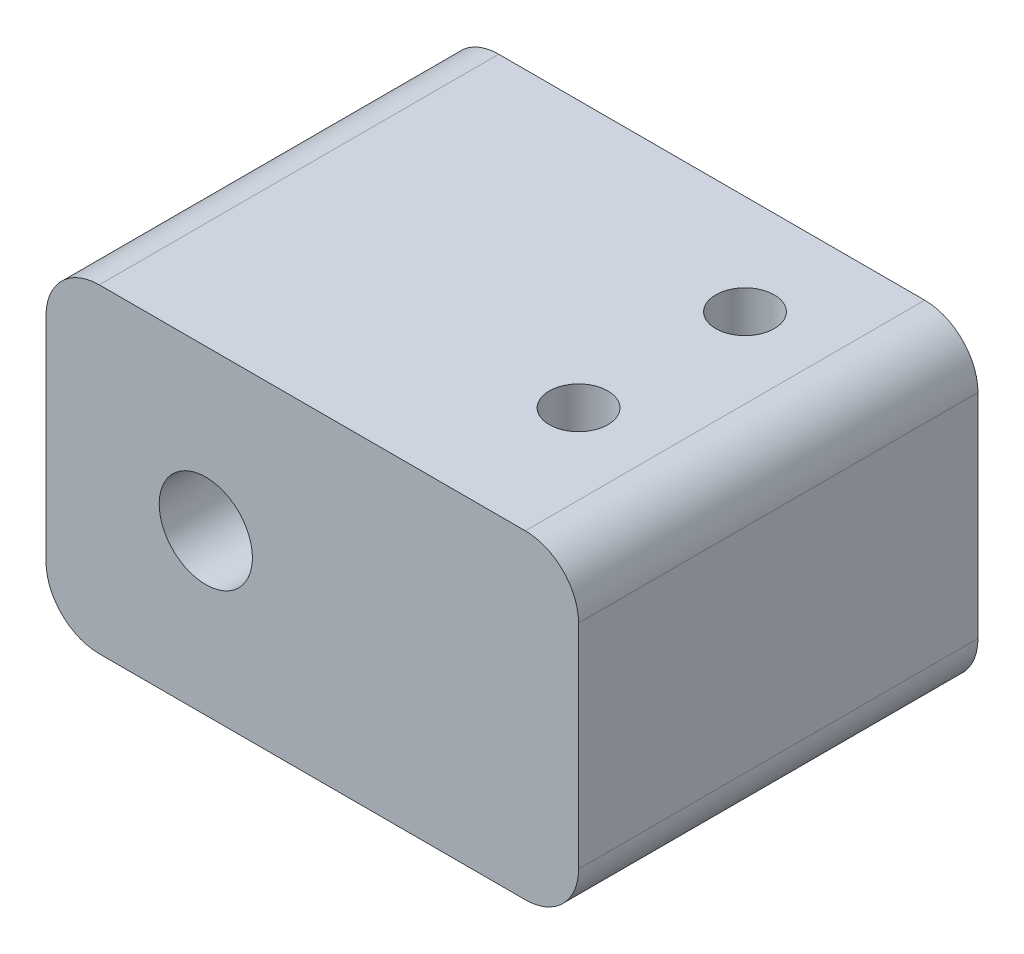
ISO-10303-21;
HEADER;
FILE_DESCRIPTION(('STEP AP214'),'2;1');
FILE_NAME('part.step','',(''),(''),'','','');
FILE_SCHEMA(('AUTOMOTIVE_DESIGN { 1 0 10303 214 1 1 1 1 }'));
ENDSEC;
DATA;
#1=APPLICATION_CONTEXT('core data for automotive mechanical design processes');
#2=APPLICATION_PROTOCOL_DEFINITION('international standard','automotive_design',2000,#1);
#3=PRODUCT_CONTEXT('',#1,'mechanical');
#4=PRODUCT('Part','Part','',(#3));
#5=PRODUCT_RELATED_PRODUCT_CATEGORY('part','',(#4));
#6=PRODUCT_DEFINITION_FORMATION('','',#4);
#7=PRODUCT_DEFINITION_CONTEXT('part definition',#1,'design');
#8=PRODUCT_DEFINITION('design','',#6,#7);
#9=PRODUCT_DEFINITION_SHAPE('','',#8);
#10=(LENGTH_UNIT() NAMED_UNIT(*) SI_UNIT(.MILLI.,.METRE.));
#11=(NAMED_UNIT(*) PLANE_ANGLE_UNIT() SI_UNIT($,.RADIAN.));
#12=(NAMED_UNIT(*) SI_UNIT($,.STERADIAN.) SOLID_ANGLE_UNIT());
#13=UNCERTAINTY_MEASURE_WITH_UNIT(LENGTH_MEASURE(1.E-05),#10,'distance_accuracy_value','');
#14=(GEOMETRIC_REPRESENTATION_CONTEXT(3) GLOBAL_UNCERTAINTY_ASSIGNED_CONTEXT((#13)) GLOBAL_UNIT_ASSIGNED_CONTEXT((#10,
#11,#12)) REPRESENTATION_CONTEXT('',''));
#15=CARTESIAN_POINT('',(0.,0.,0.));
#16=DIRECTION('',(0.,0.,1.));
#17=DIRECTION('',(1.,0.,0.));
#18=AXIS2_PLACEMENT_3D('',#15,#16,#17);
#19=CARTESIAN_POINT('',(0.,0.,-15.));
#20=DIRECTION('',(0.,0.,-1.));
#21=DIRECTION('',(-1.,0.,0.));
#22=AXIS2_PLACEMENT_3D('',#19,#20,#21);
#23=PLANE('',#22);
#24=DIRECTION('',(1.,0.,0.));
#25=VECTOR('',#24,1.);
#26=CARTESIAN_POINT('',(-6.,6.,-15.));
#27=LINE('',#26,#25);
#28=CARTESIAN_POINT('',(-4.,6.,-15.));
#29=VERTEX_POINT('',#28);
#30=CARTESIAN_POINT('',(12.,6.,-15.));
#31=VERTEX_POINT('',#30);
#32=EDGE_CURVE('E189',#29,#31,#27,.T.);
#33=ORIENTED_EDGE('',*,*,#32,.T.);
#34=CARTESIAN_POINT('',(12.,4.,-15.));
#35=DIRECTION('',(0.,0.,-1.));
#36=DIRECTION('',(-1.,0.,0.));
#37=AXIS2_PLACEMENT_3D('',#34,#35,#36);
#38=CIRCLE('',#37,2.);
#39=CARTESIAN_POINT('',(14.,4.,-15.));
#40=VERTEX_POINT('',#39);
#41=EDGE_CURVE('E228',#31,#40,#38,.T.);
#42=ORIENTED_EDGE('',*,*,#41,.T.);
#43=DIRECTION('',(0.,1.,0.));
#44=VECTOR('',#43,1.);
#45=CARTESIAN_POINT('',(14.,-6.,-15.));
#46=LINE('',#45,#44);
#47=CARTESIAN_POINT('',(14.,-4.,-15.));
#48=VERTEX_POINT('',#47);
#49=EDGE_CURVE('E165',#48,#40,#46,.T.);
#50=ORIENTED_EDGE('',*,*,#49,.F.);
#51=CARTESIAN_POINT('',(12.,-4.,-15.));
#52=DIRECTION('',(0.,0.,-1.));
#53=DIRECTION('',(-1.,0.,0.));
#54=AXIS2_PLACEMENT_3D('',#51,#52,#53);
#55=CIRCLE('',#54,2.);
#56=CARTESIAN_POINT('',(12.,-6.,-15.));
#57=VERTEX_POINT('',#56);
#58=EDGE_CURVE('E226',#48,#57,#55,.T.);
#59=ORIENTED_EDGE('',*,*,#58,.T.);
#60=DIRECTION('',(-1.,0.,0.));
#61=VECTOR('',#60,1.);
#62=CARTESIAN_POINT('',(-6.,-6.,-15.));
#63=LINE('',#62,#61);
#64=CARTESIAN_POINT('',(-4.,-6.,-15.));
#65=VERTEX_POINT('',#64);
#66=EDGE_CURVE('E182',#57,#65,#63,.T.);
#67=ORIENTED_EDGE('',*,*,#66,.T.);
#68=CARTESIAN_POINT('',(-4.,-4.,-15.));
#69=DIRECTION('',(0.,0.,-1.));
#70=DIRECTION('',(-1.,0.,0.));
#71=AXIS2_PLACEMENT_3D('',#68,#69,#70);
#72=CIRCLE('',#71,2.);
#73=CARTESIAN_POINT('',(-6.,-4.,-15.));
#74=VERTEX_POINT('',#73);
#75=EDGE_CURVE('E222',#65,#74,#72,.T.);
#76=ORIENTED_EDGE('',*,*,#75,.T.);
#77=DIRECTION('',(0.,1.,0.));
#78=VECTOR('',#77,1.);
#79=CARTESIAN_POINT('',(-6.,-6.,-15.));
#80=LINE('',#79,#78);
#81=CARTESIAN_POINT('',(-6.,4.,-15.));
#82=VERTEX_POINT('',#81);
#83=EDGE_CURVE('E185',#74,#82,#80,.T.);
#84=ORIENTED_EDGE('',*,*,#83,.T.);
#85=CARTESIAN_POINT('',(-4.,4.,-15.));
#86=DIRECTION('',(0.,0.,-1.));
#87=DIRECTION('',(-1.,0.,0.));
#88=AXIS2_PLACEMENT_3D('',#85,#86,#87);
#89=CIRCLE('',#88,2.);
#90=EDGE_CURVE('E224',#82,#29,#89,.T.);
#91=ORIENTED_EDGE('',*,*,#90,.T.);
#92=EDGE_LOOP('',(#33,#42,#50,#59,#67,#76,#84,#91));
#93=FACE_BOUND('',#92,.T.);
#94=DIRECTION('',(-1.,0.,0.));
#95=VECTOR('',#94,1.);
#96=CARTESIAN_POINT('',(-3.25,-3.25,-15.));
#97=LINE('',#96,#95);
#98=CARTESIAN_POINT('',(3.25,-3.25,-15.));
#99=VERTEX_POINT('',#98);
#100=CARTESIAN_POINT('',(-3.25,-3.25,-15.));
#101=VERTEX_POINT('',#100);
#102=EDGE_CURVE('E171',#99,#101,#97,.T.);
#103=ORIENTED_EDGE('',*,*,#102,.F.);
#104=DIRECTION('',(0.,-1.,0.));
#105=VECTOR('',#104,1.);
#106=CARTESIAN_POINT('',(3.25,-3.25,-15.));
#107=LINE('',#106,#105);
#108=CARTESIAN_POINT('',(3.25,3.25,-15.));
#109=VERTEX_POINT('',#108);
#110=EDGE_CURVE('E169',#109,#99,#107,.T.);
#111=ORIENTED_EDGE('',*,*,#110,.F.);
#112=DIRECTION('',(1.,0.,0.));
#113=VECTOR('',#112,1.);
#114=CARTESIAN_POINT('',(-3.25,3.25,-15.));
#115=LINE('',#114,#113);
#116=CARTESIAN_POINT('',(-3.25,3.25,-15.));
#117=VERTEX_POINT('',#116);
#118=EDGE_CURVE('E132',#117,#109,#115,.T.);
#119=ORIENTED_EDGE('',*,*,#118,.F.);
#120=DIRECTION('',(0.,1.,0.));
#121=VECTOR('',#120,1.);
#122=CARTESIAN_POINT('',(-3.25,-3.25,-15.));
#123=LINE('',#122,#121);
#124=EDGE_CURVE('E173',#101,#117,#123,.T.);
#125=ORIENTED_EDGE('',*,*,#124,.F.);
#126=EDGE_LOOP('',(#103,#111,#119,#125));
#127=FACE_BOUND('',#126,.T.);
#128=ADVANCED_FACE('F36',(#93,#127),#23,.T.);
#129=CARTESIAN_POINT('',(0.,0.,0.));
#130=DIRECTION('',(0.,0.,-1.));
#131=DIRECTION('',(-1.,0.,0.));
#132=AXIS2_PLACEMENT_3D('',#129,#130,#131);
#133=PLANE('',#132);
#134=DIRECTION('',(0.,-1.,0.));
#135=VECTOR('',#134,1.);
#136=CARTESIAN_POINT('',(14.,6.,0.));
#137=LINE('',#136,#135);
#138=CARTESIAN_POINT('',(14.,4.,0.));
#139=VERTEX_POINT('',#138);
#140=CARTESIAN_POINT('',(14.,-4.,0.));
#141=VERTEX_POINT('',#140);
#142=EDGE_CURVE('E162',#139,#141,#137,.T.);
#143=ORIENTED_EDGE('',*,*,#142,.F.);
#144=CARTESIAN_POINT('',(12.,4.,0.));
#145=DIRECTION('',(0.,0.,-1.));
#146=DIRECTION('',(-1.,0.,0.));
#147=AXIS2_PLACEMENT_3D('',#144,#145,#146);
#148=CIRCLE('',#147,2.);
#149=CARTESIAN_POINT('',(12.,6.,0.));
#150=VERTEX_POINT('',#149);
#151=EDGE_CURVE('E215',#139,#150,#148,.F.);
#152=ORIENTED_EDGE('',*,*,#151,.T.);
#153=DIRECTION('',(1.,0.,0.));
#154=VECTOR('',#153,1.);
#155=CARTESIAN_POINT('',(-6.,6.,0.));
#156=LINE('',#155,#154);
#157=CARTESIAN_POINT('',(-4.,6.,0.));
#158=VERTEX_POINT('',#157);
#159=EDGE_CURVE('E186',#158,#150,#156,.T.);
#160=ORIENTED_EDGE('',*,*,#159,.F.);
#161=CARTESIAN_POINT('',(-4.,4.,0.));
#162=DIRECTION('',(0.,0.,-1.));
#163=DIRECTION('',(-1.,0.,0.));
#164=AXIS2_PLACEMENT_3D('',#161,#162,#163);
#165=CIRCLE('',#164,2.);
#166=CARTESIAN_POINT('',(-6.,4.,0.));
#167=VERTEX_POINT('',#166);
#168=EDGE_CURVE('E211',#158,#167,#165,.F.);
#169=ORIENTED_EDGE('',*,*,#168,.T.);
#170=DIRECTION('',(0.,1.,0.));
#171=VECTOR('',#170,1.);
#172=CARTESIAN_POINT('',(-6.,-6.,0.));
#173=LINE('',#172,#171);
#174=CARTESIAN_POINT('',(-6.,-4.,0.));
#175=VERTEX_POINT('',#174);
#176=EDGE_CURVE('E195',#175,#167,#173,.T.);
#177=ORIENTED_EDGE('',*,*,#176,.F.);
#178=CARTESIAN_POINT('',(-4.,-4.,0.));
#179=DIRECTION('',(0.,0.,-1.));
#180=DIRECTION('',(-1.,0.,0.));
#181=AXIS2_PLACEMENT_3D('',#178,#179,#180);
#182=CIRCLE('',#181,2.);
#183=CARTESIAN_POINT('',(-4.,-6.,0.));
#184=VERTEX_POINT('',#183);
#185=EDGE_CURVE('E209',#175,#184,#182,.F.);
#186=ORIENTED_EDGE('',*,*,#185,.T.);
#187=DIRECTION('',(-1.,0.,0.));
#188=VECTOR('',#187,1.);
#189=CARTESIAN_POINT('',(-6.,-6.,0.));
#190=LINE('',#189,#188);
#191=CARTESIAN_POINT('',(12.,-6.,0.));
#192=VERTEX_POINT('',#191);
#193=EDGE_CURVE('E181',#192,#184,#190,.T.);
#194=ORIENTED_EDGE('',*,*,#193,.F.);
#195=CARTESIAN_POINT('',(12.,-4.,0.));
#196=DIRECTION('',(0.,0.,-1.));
#197=DIRECTION('',(-1.,0.,0.));
#198=AXIS2_PLACEMENT_3D('',#195,#196,#197);
#199=CIRCLE('',#198,2.);
#200=EDGE_CURVE('E213',#192,#141,#199,.F.);
#201=ORIENTED_EDGE('',*,*,#200,.T.);
#202=EDGE_LOOP('',(#143,#152,#160,#169,#177,#186,#194,#201));
#203=FACE_BOUND('',#202,.T.);
#204=CARTESIAN_POINT('',(0.,0.,0.));
#205=DIRECTION('',(0.,0.,-1.));
#206=DIRECTION('',(-1.,0.,0.));
#207=AXIS2_PLACEMENT_3D('',#204,#205,#206);
#208=CIRCLE('',#207,1.75);
#209=CARTESIAN_POINT('',(-1.75,0.,0.));
#210=VERTEX_POINT('',#209);
#211=EDGE_CURVE('E142',#210,#210,#208,.F.);
#212=ORIENTED_EDGE('',*,*,#211,.F.);
#213=EDGE_LOOP('',(#212));
#214=FACE_BOUND('',#213,.T.);
#215=ADVANCED_FACE('F244',(#203,#214),#133,.F.);
#216=CARTESIAN_POINT('',(-6.,-6.,-15.));
#217=DIRECTION('',(0.,1.,0.));
#218=DIRECTION('',(0.,0.,1.));
#219=AXIS2_PLACEMENT_3D('',#216,#217,#218);
#220=PLANE('',#219);
#221=CARTESIAN_POINT('',(9.,-6.,-11.25));
#222=DIRECTION('',(0.,1.,0.));
#223=DIRECTION('',(0.,0.,1.));
#224=AXIS2_PLACEMENT_3D('',#221,#222,#223);
#225=CIRCLE('',#224,1.1);
#226=CARTESIAN_POINT('',(9.,-6.,-10.15));
#227=VERTEX_POINT('',#226);
#228=EDGE_CURVE('E156',#227,#227,#225,.T.);
#229=ORIENTED_EDGE('',*,*,#228,.T.);
#230=EDGE_LOOP('',(#229));
#231=FACE_BOUND('',#230,.T.);
#232=CARTESIAN_POINT('',(9.,-6.,-5.));
#233=DIRECTION('',(0.,1.,0.));
#234=DIRECTION('',(0.,0.,1.));
#235=AXIS2_PLACEMENT_3D('',#232,#233,#234);
#236=CIRCLE('',#235,1.1);
#237=CARTESIAN_POINT('',(9.,-6.,-3.9));
#238=VERTEX_POINT('',#237);
#239=EDGE_CURVE('E149',#238,#238,#236,.T.);
#240=ORIENTED_EDGE('',*,*,#239,.T.);
#241=EDGE_LOOP('',(#240));
#242=FACE_BOUND('',#241,.T.);
#243=ORIENTED_EDGE('',*,*,#66,.F.);
#244=DIRECTION('',(0.,0.,-1.));
#245=VECTOR('',#244,1.);
#246=CARTESIAN_POINT('',(12.,-6.,0.));
#247=LINE('',#246,#245);
#248=EDGE_CURVE('E232',#57,#192,#247,.F.);
#249=ORIENTED_EDGE('',*,*,#248,.T.);
#250=ORIENTED_EDGE('',*,*,#193,.T.);
#251=DIRECTION('',(0.,0.,1.));
#252=VECTOR('',#251,1.);
#253=CARTESIAN_POINT('',(-4.,-6.,-15.));
#254=LINE('',#253,#252);
#255=EDGE_CURVE('E230',#184,#65,#254,.F.);
#256=ORIENTED_EDGE('',*,*,#255,.T.);
#257=EDGE_LOOP('',(#243,#249,#250,#256));
#258=FACE_BOUND('',#257,.T.);
#259=ADVANCED_FACE('F272',(#231,#242,#258),#220,.F.);
#260=CARTESIAN_POINT('',(-6.,-6.,-15.));
#261=DIRECTION('',(1.,0.,0.));
#262=DIRECTION('',(0.,0.,-1.));
#263=AXIS2_PLACEMENT_3D('',#260,#261,#262);
#264=PLANE('',#263);
#265=ORIENTED_EDGE('',*,*,#176,.T.);
#266=DIRECTION('',(0.,0.,1.));
#267=VECTOR('',#266,1.);
#268=CARTESIAN_POINT('',(-6.,4.,-15.));
#269=LINE('',#268,#267);
#270=EDGE_CURVE('E11',#167,#82,#269,.F.);
#271=ORIENTED_EDGE('',*,*,#270,.T.);
#272=ORIENTED_EDGE('',*,*,#83,.F.);
#273=DIRECTION('',(0.,0.,1.));
#274=VECTOR('',#273,1.);
#275=CARTESIAN_POINT('',(-6.,-4.,-15.));
#276=LINE('',#275,#274);
#277=EDGE_CURVE('E44',#74,#175,#276,.T.);
#278=ORIENTED_EDGE('',*,*,#277,.T.);
#279=EDGE_LOOP('',(#265,#271,#272,#278));
#280=FACE_BOUND('',#279,.T.);
#281=ADVANCED_FACE('F238',(#280),#264,.F.);
#282=CARTESIAN_POINT('',(-6.,6.,-15.));
#283=DIRECTION('',(0.,-1.,0.));
#284=DIRECTION('',(0.,0.,-1.));
#285=AXIS2_PLACEMENT_3D('',#282,#283,#284);
#286=PLANE('',#285);
#287=CARTESIAN_POINT('',(9.,6.,-11.25));
#288=DIRECTION('',(0.,-1.,0.));
#289=DIRECTION('',(0.,0.,-1.));
#290=AXIS2_PLACEMENT_3D('',#287,#288,#289);
#291=CIRCLE('',#290,1.1);
#292=CARTESIAN_POINT('',(9.,6.,-12.35));
#293=VERTEX_POINT('',#292);
#294=EDGE_CURVE('E166',#293,#293,#291,.T.);
#295=ORIENTED_EDGE('',*,*,#294,.T.);
#296=EDGE_LOOP('',(#295));
#297=FACE_BOUND('',#296,.T.);
#298=CARTESIAN_POINT('',(9.,6.,-5.));
#299=DIRECTION('',(0.,-1.,0.));
#300=DIRECTION('',(0.,0.,-1.));
#301=AXIS2_PLACEMENT_3D('',#298,#299,#300);
#302=CIRCLE('',#301,1.1);
#303=CARTESIAN_POINT('',(9.,6.,-6.1));
#304=VERTEX_POINT('',#303);
#305=EDGE_CURVE('E159',#304,#304,#302,.T.);
#306=ORIENTED_EDGE('',*,*,#305,.T.);
#307=EDGE_LOOP('',(#306));
#308=FACE_BOUND('',#307,.T.);
#309=ORIENTED_EDGE('',*,*,#159,.T.);
#310=DIRECTION('',(0.,0.,1.));
#311=VECTOR('',#310,1.);
#312=CARTESIAN_POINT('',(12.,6.,-15.));
#313=LINE('',#312,#311);
#314=EDGE_CURVE('E220',#150,#31,#313,.F.);
#315=ORIENTED_EDGE('',*,*,#314,.T.);
#316=ORIENTED_EDGE('',*,*,#32,.F.);
#317=DIRECTION('',(0.,0.,1.));
#318=VECTOR('',#317,1.);
#319=CARTESIAN_POINT('',(-4.,6.,-15.));
#320=LINE('',#319,#318);
#321=EDGE_CURVE('E217',#29,#158,#320,.T.);
#322=ORIENTED_EDGE('',*,*,#321,.T.);
#323=EDGE_LOOP('',(#309,#315,#316,#322));
#324=FACE_BOUND('',#323,.T.);
#325=ADVANCED_FACE('F254',(#297,#308,#324),#286,.F.);
#326=CARTESIAN_POINT('',(3.25,-3.25,-15.));
#327=DIRECTION('',(-1.,0.,0.));
#328=DIRECTION('',(0.,0.,1.));
#329=AXIS2_PLACEMENT_3D('',#326,#327,#328);
#330=PLANE('',#329);
#331=DIRECTION('',(0.,1.,0.));
#332=VECTOR('',#331,1.);
#333=CARTESIAN_POINT('',(3.25,0.,-3.));
#334=LINE('',#333,#332);
#335=CARTESIAN_POINT('',(3.25,-3.25,-3.));
#336=VERTEX_POINT('',#335);
#337=CARTESIAN_POINT('',(3.25,3.25,-3.));
#338=VERTEX_POINT('',#337);
#339=EDGE_CURVE('E138',#336,#338,#334,.T.);
#340=ORIENTED_EDGE('',*,*,#339,.T.);
#341=DIRECTION('',(0.,0.,1.));
#342=VECTOR('',#341,1.);
#343=CARTESIAN_POINT('',(3.25,3.25,-15.));
#344=LINE('',#343,#342);
#345=EDGE_CURVE('E126',#109,#338,#344,.T.);
#346=ORIENTED_EDGE('',*,*,#345,.F.);
#347=ORIENTED_EDGE('',*,*,#110,.T.);
#348=DIRECTION('',(0.,0.,1.));
#349=VECTOR('',#348,1.);
#350=CARTESIAN_POINT('',(3.25,-3.25,-15.));
#351=LINE('',#350,#349);
#352=EDGE_CURVE('E140',#99,#336,#351,.T.);
#353=ORIENTED_EDGE('',*,*,#352,.T.);
#354=EDGE_LOOP('',(#340,#346,#347,#353));
#355=FACE_BOUND('',#354,.T.);
#356=ADVANCED_FACE('F139',(#355),#330,.T.);
#357=CARTESIAN_POINT('',(-3.25,-3.25,-15.));
#358=DIRECTION('',(0.,1.,0.));
#359=DIRECTION('',(0.,0.,1.));
#360=AXIS2_PLACEMENT_3D('',#357,#358,#359);
#361=PLANE('',#360);
#362=DIRECTION('',(1.,0.,0.));
#363=VECTOR('',#362,1.);
#364=CARTESIAN_POINT('',(0.,-3.25,-3.));
#365=LINE('',#364,#363);
#366=CARTESIAN_POINT('',(-3.25,-3.25,-3.));
#367=VERTEX_POINT('',#366);
#368=EDGE_CURVE('E51',#367,#336,#365,.T.);
#369=ORIENTED_EDGE('',*,*,#368,.T.);
#370=ORIENTED_EDGE('',*,*,#352,.F.);
#371=ORIENTED_EDGE('',*,*,#102,.T.);
#372=DIRECTION('',(0.,0.,1.));
#373=VECTOR('',#372,1.);
#374=CARTESIAN_POINT('',(-3.25,-3.25,-15.));
#375=LINE('',#374,#373);
#376=EDGE_CURVE('E178',#101,#367,#375,.T.);
#377=ORIENTED_EDGE('',*,*,#376,.T.);
#378=EDGE_LOOP('',(#369,#370,#371,#377));
#379=FACE_BOUND('',#378,.T.);
#380=ADVANCED_FACE('F334',(#379),#361,.T.);
#381=CARTESIAN_POINT('',(-3.25,-3.25,-15.));
#382=DIRECTION('',(1.,0.,0.));
#383=DIRECTION('',(0.,0.,-1.));
#384=AXIS2_PLACEMENT_3D('',#381,#382,#383);
#385=PLANE('',#384);
#386=DIRECTION('',(0.,1.,0.));
#387=VECTOR('',#386,1.);
#388=CARTESIAN_POINT('',(-3.25,0.,-3.));
#389=LINE('',#388,#387);
#390=CARTESIAN_POINT('',(-3.25,3.25,-3.));
#391=VERTEX_POINT('',#390);
#392=EDGE_CURVE('E59',#367,#391,#389,.T.);
#393=ORIENTED_EDGE('',*,*,#392,.F.);
#394=ORIENTED_EDGE('',*,*,#376,.F.);
#395=ORIENTED_EDGE('',*,*,#124,.T.);
#396=DIRECTION('',(0.,0.,1.));
#397=VECTOR('',#396,1.);
#398=CARTESIAN_POINT('',(-3.25,3.25,-15.));
#399=LINE('',#398,#397);
#400=EDGE_CURVE('E135',#117,#391,#399,.T.);
#401=ORIENTED_EDGE('',*,*,#400,.T.);
#402=EDGE_LOOP('',(#393,#394,#395,#401));
#403=FACE_BOUND('',#402,.T.);
#404=ADVANCED_FACE('F343',(#403),#385,.T.);
#405=CARTESIAN_POINT('',(-3.25,3.25,-15.));
#406=DIRECTION('',(0.,-1.,0.));
#407=DIRECTION('',(0.,0.,-1.));
#408=AXIS2_PLACEMENT_3D('',#405,#406,#407);
#409=PLANE('',#408);
#410=DIRECTION('',(1.,0.,0.));
#411=VECTOR('',#410,1.);
#412=CARTESIAN_POINT('',(0.,3.25,-3.));
#413=LINE('',#412,#411);
#414=EDGE_CURVE('E130',#391,#338,#413,.T.);
#415=ORIENTED_EDGE('',*,*,#414,.F.);
#416=ORIENTED_EDGE('',*,*,#400,.F.);
#417=ORIENTED_EDGE('',*,*,#118,.T.);
#418=ORIENTED_EDGE('',*,*,#345,.T.);
#419=EDGE_LOOP('',(#415,#416,#417,#418));
#420=FACE_BOUND('',#419,.T.);
#421=ADVANCED_FACE('F128',(#420),#409,.T.);
#422=CARTESIAN_POINT('',(14.,0.,0.));
#423=DIRECTION('',(1.,0.,0.));
#424=DIRECTION('',(0.,0.,-1.));
#425=AXIS2_PLACEMENT_3D('',#422,#423,#424);
#426=PLANE('',#425);
#427=ORIENTED_EDGE('',*,*,#49,.T.);
#428=DIRECTION('',(0.,0.,1.));
#429=VECTOR('',#428,1.);
#430=CARTESIAN_POINT('',(14.,4.,0.));
#431=LINE('',#430,#429);
#432=EDGE_CURVE('E206',#40,#139,#431,.T.);
#433=ORIENTED_EDGE('',*,*,#432,.T.);
#434=ORIENTED_EDGE('',*,*,#142,.T.);
#435=DIRECTION('',(0.,0.,-1.));
#436=VECTOR('',#435,1.);
#437=CARTESIAN_POINT('',(14.,-4.,-15.));
#438=LINE('',#437,#436);
#439=EDGE_CURVE('E192',#141,#48,#438,.T.);
#440=ORIENTED_EDGE('',*,*,#439,.T.);
#441=EDGE_LOOP('',(#427,#433,#434,#440));
#442=FACE_BOUND('',#441,.T.);
#443=ADVANCED_FACE('F264',(#442),#426,.T.);
#444=CARTESIAN_POINT('',(9.,-6.,-5.));
#445=DIRECTION('',(0.,1.,0.));
#446=DIRECTION('',(0.,0.,1.));
#447=AXIS2_PLACEMENT_3D('',#444,#445,#446);
#448=CYLINDRICAL_SURFACE('',#447,1.1);
#449=ORIENTED_EDGE('',*,*,#239,.F.);
#450=EDGE_LOOP('',(#449));
#451=FACE_BOUND('',#450,.T.);
#452=ORIENTED_EDGE('',*,*,#305,.F.);
#453=EDGE_LOOP('',(#452));
#454=FACE_BOUND('',#453,.T.);
#455=ADVANCED_FACE('F391',(#451,#454),#448,.F.);
#456=CARTESIAN_POINT('',(9.,-6.,-11.25));
#457=DIRECTION('',(0.,1.,0.));
#458=DIRECTION('',(0.,0.,1.));
#459=AXIS2_PLACEMENT_3D('',#456,#457,#458);
#460=CYLINDRICAL_SURFACE('',#459,1.1);
#461=ORIENTED_EDGE('',*,*,#228,.F.);
#462=EDGE_LOOP('',(#461));
#463=FACE_BOUND('',#462,.T.);
#464=ORIENTED_EDGE('',*,*,#294,.F.);
#465=EDGE_LOOP('',(#464));
#466=FACE_BOUND('',#465,.T.);
#467=ADVANCED_FACE('F301',(#463,#466),#460,.F.);
#468=CARTESIAN_POINT('',(12.,4.,0.));
#469=DIRECTION('',(0.,0.,-1.));
#470=DIRECTION('',(-1.,0.,0.));
#471=AXIS2_PLACEMENT_3D('',#468,#469,#470);
#472=CYLINDRICAL_SURFACE('',#471,2.);
#473=ORIENTED_EDGE('',*,*,#41,.F.);
#474=ORIENTED_EDGE('',*,*,#314,.F.);
#475=ORIENTED_EDGE('',*,*,#151,.F.);
#476=ORIENTED_EDGE('',*,*,#432,.F.);
#477=EDGE_LOOP('',(#473,#474,#475,#476));
#478=FACE_BOUND('',#477,.T.);
#479=ADVANCED_FACE('F262',(#478),#472,.T.);
#480=CARTESIAN_POINT('',(12.,-4.,0.));
#481=DIRECTION('',(0.,0.,1.));
#482=DIRECTION('',(1.,0.,0.));
#483=AXIS2_PLACEMENT_3D('',#480,#481,#482);
#484=CYLINDRICAL_SURFACE('',#483,2.);
#485=ORIENTED_EDGE('',*,*,#200,.F.);
#486=ORIENTED_EDGE('',*,*,#248,.F.);
#487=ORIENTED_EDGE('',*,*,#58,.F.);
#488=ORIENTED_EDGE('',*,*,#439,.F.);
#489=EDGE_LOOP('',(#485,#486,#487,#488));
#490=FACE_BOUND('',#489,.T.);
#491=ADVANCED_FACE('F269',(#490),#484,.T.);
#492=CARTESIAN_POINT('',(-4.,4.,-15.));
#493=DIRECTION('',(0.,0.,1.));
#494=DIRECTION('',(1.,0.,0.));
#495=AXIS2_PLACEMENT_3D('',#492,#493,#494);
#496=CYLINDRICAL_SURFACE('',#495,2.);
#497=ORIENTED_EDGE('',*,*,#90,.F.);
#498=ORIENTED_EDGE('',*,*,#270,.F.);
#499=ORIENTED_EDGE('',*,*,#168,.F.);
#500=ORIENTED_EDGE('',*,*,#321,.F.);
#501=EDGE_LOOP('',(#497,#498,#499,#500));
#502=FACE_BOUND('',#501,.T.);
#503=ADVANCED_FACE('F251',(#502),#496,.T.);
#504=CARTESIAN_POINT('',(-4.,-4.,-15.));
#505=DIRECTION('',(0.,0.,1.));
#506=DIRECTION('',(1.,0.,0.));
#507=AXIS2_PLACEMENT_3D('',#504,#505,#506);
#508=CYLINDRICAL_SURFACE('',#507,2.);
#509=ORIENTED_EDGE('',*,*,#75,.F.);
#510=ORIENTED_EDGE('',*,*,#255,.F.);
#511=ORIENTED_EDGE('',*,*,#185,.F.);
#512=ORIENTED_EDGE('',*,*,#277,.F.);
#513=EDGE_LOOP('',(#509,#510,#511,#512));
#514=FACE_BOUND('',#513,.T.);
#515=ADVANCED_FACE('F38',(#514),#508,.T.);
#516=CARTESIAN_POINT('',(0.,0.,-3.));
#517=DIRECTION('',(0.,0.,1.));
#518=DIRECTION('',(1.,0.,0.));
#519=AXIS2_PLACEMENT_3D('',#516,#517,#518);
#520=CYLINDRICAL_SURFACE('',#519,1.75);
#521=CARTESIAN_POINT('',(0.,0.,-3.));
#522=DIRECTION('',(0.,0.,-1.));
#523=DIRECTION('',(-1.,0.,0.));
#524=AXIS2_PLACEMENT_3D('',#521,#522,#523);
#525=CIRCLE('',#524,1.75);
#526=CARTESIAN_POINT('',(-1.75,0.,-3.));
#527=VERTEX_POINT('',#526);
#528=EDGE_CURVE('E146',#527,#527,#525,.F.);
#529=ORIENTED_EDGE('',*,*,#528,.F.);
#530=EDGE_LOOP('',(#529));
#531=FACE_BOUND('',#530,.T.);
#532=ORIENTED_EDGE('',*,*,#211,.T.);
#533=EDGE_LOOP('',(#532));
#534=FACE_BOUND('',#533,.T.);
#535=ADVANCED_FACE('F275',(#531,#534),#520,.F.);
#536=CARTESIAN_POINT('',(0.,0.,-3.));
#537=DIRECTION('',(0.,0.,-1.));
#538=DIRECTION('',(-1.,0.,0.));
#539=AXIS2_PLACEMENT_3D('',#536,#537,#538);
#540=PLANE('',#539);
#541=ORIENTED_EDGE('',*,*,#339,.F.);
#542=ORIENTED_EDGE('',*,*,#368,.F.);
#543=ORIENTED_EDGE('',*,*,#392,.T.);
#544=ORIENTED_EDGE('',*,*,#414,.T.);
#545=EDGE_LOOP('',(#541,#542,#543,#544));
#546=FACE_BOUND('',#545,.T.);
#547=ORIENTED_EDGE('',*,*,#528,.T.);
#548=EDGE_LOOP('',(#547));
#549=FACE_BOUND('',#548,.T.);
#550=ADVANCED_FACE('F144',(#546,#549),#540,.T.);
#551=CLOSED_SHELL('',(#128,#215,#259,#281,#325,#356,#380,#404,#421,#443,#455,#467,#479,#491,
#503,#515,#535,#550));
#552=MANIFOLD_SOLID_BREP('B2',#551);
#553=ADVANCED_BREP_SHAPE_REPRESENTATION('',(#18,#552),#14);
#554=SHAPE_DEFINITION_REPRESENTATION(#9,#553);
ENDSEC;
END-ISO-10303-21;
